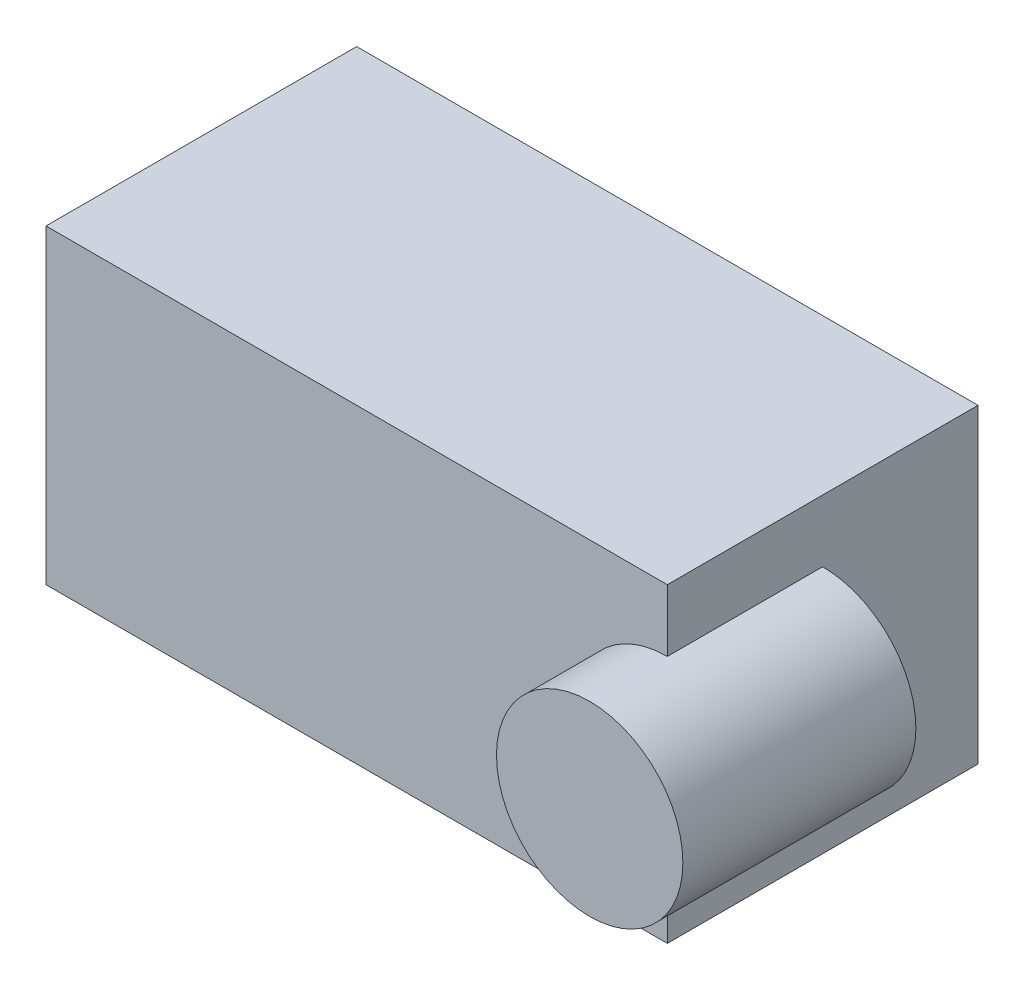
ISO-10303-21;
HEADER;
FILE_DESCRIPTION(('STEP AP214'),'2;1');
FILE_NAME('part.step','',(''),(''),'','','');
FILE_SCHEMA(('AUTOMOTIVE_DESIGN { 1 0 10303 214 1 1 1 1 }'));
ENDSEC;
DATA;
#1=APPLICATION_CONTEXT('core data for automotive mechanical design processes');
#2=APPLICATION_PROTOCOL_DEFINITION('international standard','automotive_design',2000,#1);
#3=PRODUCT_CONTEXT('',#1,'mechanical');
#4=PRODUCT('Part','Part','',(#3));
#5=PRODUCT_RELATED_PRODUCT_CATEGORY('part','',(#4));
#6=PRODUCT_DEFINITION_FORMATION('','',#4);
#7=PRODUCT_DEFINITION_CONTEXT('part definition',#1,'design');
#8=PRODUCT_DEFINITION('design','',#6,#7);
#9=PRODUCT_DEFINITION_SHAPE('','',#8);
#10=(LENGTH_UNIT() NAMED_UNIT(*) SI_UNIT(.MILLI.,.METRE.));
#11=(NAMED_UNIT(*) PLANE_ANGLE_UNIT() SI_UNIT($,.RADIAN.));
#12=(NAMED_UNIT(*) SI_UNIT($,.STERADIAN.) SOLID_ANGLE_UNIT());
#13=UNCERTAINTY_MEASURE_WITH_UNIT(LENGTH_MEASURE(1.E-05),#10,'distance_accuracy_value','');
#14=(GEOMETRIC_REPRESENTATION_CONTEXT(3) GLOBAL_UNCERTAINTY_ASSIGNED_CONTEXT((#13)) GLOBAL_UNIT_ASSIGNED_CONTEXT((#10,
#11,#12)) REPRESENTATION_CONTEXT('',''));
#15=CARTESIAN_POINT('',(0.,0.,0.));
#16=DIRECTION('',(0.,0.,1.));
#17=DIRECTION('',(1.,0.,0.));
#18=AXIS2_PLACEMENT_3D('',#15,#16,#17);
#19=CARTESIAN_POINT('',(40.,0.,10.));
#20=DIRECTION('',(-1.,0.,0.));
#21=DIRECTION('',(0.,0.,1.));
#22=AXIS2_PLACEMENT_3D('',#19,#20,#21);
#23=PLANE('',#22);
#24=DIRECTION('',(0.,0.,-1.));
#25=VECTOR('',#24,1.);
#26=CARTESIAN_POINT('',(40.,16.,15.));
#27=LINE('',#26,#25);
#28=CARTESIAN_POINT('',(40.,16.,0.));
#29=VERTEX_POINT('',#28);
#30=CARTESIAN_POINT('',(40.,16.,10.));
#31=VERTEX_POINT('',#30);
#32=EDGE_CURVE('E56',#29,#31,#27,.F.);
#33=ORIENTED_EDGE('',*,*,#32,.F.);
#34=DIRECTION('',(0.,1.,0.));
#35=VECTOR('',#34,1.);
#36=CARTESIAN_POINT('',(40.,0.,0.));
#37=LINE('',#36,#35);
#38=CARTESIAN_POINT('',(40.,4.,0.));
#39=VERTEX_POINT('',#38);
#40=EDGE_CURVE('E11',#39,#29,#37,.T.);
#41=ORIENTED_EDGE('',*,*,#40,.F.);
#42=DIRECTION('',(0.,0.,-1.));
#43=VECTOR('',#42,1.);
#44=CARTESIAN_POINT('',(40.,4.,15.));
#45=LINE('',#44,#43);
#46=CARTESIAN_POINT('',(40.,4.,10.));
#47=VERTEX_POINT('',#46);
#48=EDGE_CURVE('E109',#47,#39,#45,.T.);
#49=ORIENTED_EDGE('',*,*,#48,.F.);
#50=DIRECTION('',(0.,1.,0.));
#51=VECTOR('',#50,1.);
#52=CARTESIAN_POINT('',(40.,0.,10.));
#53=LINE('',#52,#51);
#54=CARTESIAN_POINT('',(40.,0.,10.));
#55=VERTEX_POINT('',#54);
#56=EDGE_CURVE('E125',#55,#47,#53,.T.);
#57=ORIENTED_EDGE('',*,*,#56,.F.);
#58=DIRECTION('',(0.,0.,-1.));
#59=VECTOR('',#58,1.);
#60=CARTESIAN_POINT('',(40.,0.,10.));
#61=LINE('',#60,#59);
#62=CARTESIAN_POINT('',(40.,0.,-10.));
#63=VERTEX_POINT('',#62);
#64=EDGE_CURVE('E137',#55,#63,#61,.T.);
#65=ORIENTED_EDGE('',*,*,#64,.T.);
#66=DIRECTION('',(0.,1.,0.));
#67=VECTOR('',#66,1.);
#68=CARTESIAN_POINT('',(40.,0.,-10.));
#69=LINE('',#68,#67);
#70=CARTESIAN_POINT('',(40.,20.,-10.));
#71=VERTEX_POINT('',#70);
#72=EDGE_CURVE('E131',#63,#71,#69,.T.);
#73=ORIENTED_EDGE('',*,*,#72,.T.);
#74=DIRECTION('',(0.,0.,-1.));
#75=VECTOR('',#74,1.);
#76=CARTESIAN_POINT('',(40.,20.,10.));
#77=LINE('',#76,#75);
#78=CARTESIAN_POINT('',(40.,20.,10.));
#79=VERTEX_POINT('',#78);
#80=EDGE_CURVE('E135',#79,#71,#77,.T.);
#81=ORIENTED_EDGE('',*,*,#80,.F.);
#82=EDGE_CURVE('E114',#31,#79,#53,.T.);
#83=ORIENTED_EDGE('',*,*,#82,.F.);
#84=EDGE_LOOP('',(#33,#41,#49,#57,#65,#73,#81,#83));
#85=FACE_BOUND('',#84,.T.);
#86=ADVANCED_FACE('F41',(#85),#23,.F.);
#87=CARTESIAN_POINT('',(0.,20.,10.));
#88=DIRECTION('',(1.,0.,0.));
#89=DIRECTION('',(0.,0.,-1.));
#90=AXIS2_PLACEMENT_3D('',#87,#88,#89);
#91=PLANE('',#90);
#92=DIRECTION('',(0.,-1.,0.));
#93=VECTOR('',#92,1.);
#94=CARTESIAN_POINT('',(0.,20.,-10.));
#95=LINE('',#94,#93);
#96=CARTESIAN_POINT('',(0.,20.,-10.));
#97=VERTEX_POINT('',#96);
#98=CARTESIAN_POINT('',(0.,0.,-10.));
#99=VERTEX_POINT('',#98);
#100=EDGE_CURVE('E115',#97,#99,#95,.T.);
#101=ORIENTED_EDGE('',*,*,#100,.T.);
#102=DIRECTION('',(0.,0.,-1.));
#103=VECTOR('',#102,1.);
#104=CARTESIAN_POINT('',(0.,0.,10.));
#105=LINE('',#104,#103);
#106=CARTESIAN_POINT('',(0.,0.,10.));
#107=VERTEX_POINT('',#106);
#108=EDGE_CURVE('E140',#107,#99,#105,.T.);
#109=ORIENTED_EDGE('',*,*,#108,.F.);
#110=DIRECTION('',(0.,-1.,0.));
#111=VECTOR('',#110,1.);
#112=CARTESIAN_POINT('',(0.,20.,10.));
#113=LINE('',#112,#111);
#114=CARTESIAN_POINT('',(0.,20.,10.));
#115=VERTEX_POINT('',#114);
#116=EDGE_CURVE('E122',#115,#107,#113,.T.);
#117=ORIENTED_EDGE('',*,*,#116,.F.);
#118=DIRECTION('',(0.,0.,-1.));
#119=VECTOR('',#118,1.);
#120=CARTESIAN_POINT('',(0.,20.,10.));
#121=LINE('',#120,#119);
#122=EDGE_CURVE('E128',#115,#97,#121,.T.);
#123=ORIENTED_EDGE('',*,*,#122,.T.);
#124=EDGE_LOOP('',(#101,#109,#117,#123));
#125=FACE_BOUND('',#124,.T.);
#126=ADVANCED_FACE('F43',(#125),#91,.F.);
#127=CARTESIAN_POINT('',(0.,0.,10.));
#128=DIRECTION('',(0.,1.,0.));
#129=DIRECTION('',(0.,0.,1.));
#130=AXIS2_PLACEMENT_3D('',#127,#128,#129);
#131=PLANE('',#130);
#132=DIRECTION('',(1.,0.,0.));
#133=VECTOR('',#132,1.);
#134=CARTESIAN_POINT('',(0.,0.,-10.));
#135=LINE('',#134,#133);
#136=EDGE_CURVE('E118',#99,#63,#135,.T.);
#137=ORIENTED_EDGE('',*,*,#136,.T.);
#138=ORIENTED_EDGE('',*,*,#64,.F.);
#139=DIRECTION('',(1.,0.,0.));
#140=VECTOR('',#139,1.);
#141=CARTESIAN_POINT('',(0.,0.,10.));
#142=LINE('',#141,#140);
#143=EDGE_CURVE('E94',#107,#55,#142,.T.);
#144=ORIENTED_EDGE('',*,*,#143,.F.);
#145=ORIENTED_EDGE('',*,*,#108,.T.);
#146=EDGE_LOOP('',(#137,#138,#144,#145));
#147=FACE_BOUND('',#146,.T.);
#148=ADVANCED_FACE('F152',(#147),#131,.F.);
#149=CARTESIAN_POINT('',(40.,20.,10.));
#150=DIRECTION('',(0.,-1.,0.));
#151=DIRECTION('',(0.,0.,-1.));
#152=AXIS2_PLACEMENT_3D('',#149,#150,#151);
#153=PLANE('',#152);
#154=DIRECTION('',(-1.,0.,0.));
#155=VECTOR('',#154,1.);
#156=CARTESIAN_POINT('',(40.,20.,-10.));
#157=LINE('',#156,#155);
#158=EDGE_CURVE('E86',#71,#97,#157,.T.);
#159=ORIENTED_EDGE('',*,*,#158,.T.);
#160=ORIENTED_EDGE('',*,*,#122,.F.);
#161=DIRECTION('',(-1.,0.,0.));
#162=VECTOR('',#161,1.);
#163=CARTESIAN_POINT('',(40.,20.,10.));
#164=LINE('',#163,#162);
#165=EDGE_CURVE('E65',#79,#115,#164,.T.);
#166=ORIENTED_EDGE('',*,*,#165,.F.);
#167=ORIENTED_EDGE('',*,*,#80,.T.);
#168=EDGE_LOOP('',(#159,#160,#166,#167));
#169=FACE_BOUND('',#168,.T.);
#170=ADVANCED_FACE('F150',(#169),#153,.F.);
#171=CARTESIAN_POINT('',(0.,0.,10.));
#172=DIRECTION('',(0.,0.,1.));
#173=DIRECTION('',(1.,0.,0.));
#174=AXIS2_PLACEMENT_3D('',#171,#172,#173);
#175=PLANE('',#174);
#176=ORIENTED_EDGE('',*,*,#56,.T.);
#177=CARTESIAN_POINT('',(40.,10.,10.));
#178=DIRECTION('',(0.,0.,1.));
#179=DIRECTION('',(1.,0.,0.));
#180=AXIS2_PLACEMENT_3D('',#177,#178,#179);
#181=CIRCLE('',#180,6.);
#182=EDGE_CURVE('E49',#47,#31,#181,.F.);
#183=ORIENTED_EDGE('',*,*,#182,.T.);
#184=ORIENTED_EDGE('',*,*,#82,.T.);
#185=ORIENTED_EDGE('',*,*,#165,.T.);
#186=ORIENTED_EDGE('',*,*,#116,.T.);
#187=ORIENTED_EDGE('',*,*,#143,.T.);
#188=EDGE_LOOP('',(#176,#183,#184,#185,#186,#187));
#189=FACE_BOUND('',#188,.T.);
#190=ADVANCED_FACE('F141',(#189),#175,.T.);
#191=CARTESIAN_POINT('',(0.,0.,-10.));
#192=DIRECTION('',(0.,0.,1.));
#193=DIRECTION('',(1.,0.,0.));
#194=AXIS2_PLACEMENT_3D('',#191,#192,#193);
#195=PLANE('',#194);
#196=ORIENTED_EDGE('',*,*,#100,.F.);
#197=ORIENTED_EDGE('',*,*,#158,.F.);
#198=ORIENTED_EDGE('',*,*,#72,.F.);
#199=ORIENTED_EDGE('',*,*,#136,.F.);
#200=EDGE_LOOP('',(#196,#197,#198,#199));
#201=FACE_BOUND('',#200,.T.);
#202=ADVANCED_FACE('F146',(#201),#195,.F.);
#203=CARTESIAN_POINT('',(40.,10.,0.));
#204=DIRECTION('',(0.,0.,1.));
#205=DIRECTION('',(1.,0.,0.));
#206=AXIS2_PLACEMENT_3D('',#203,#204,#205);
#207=PLANE('',#206);
#208=CARTESIAN_POINT('',(40.,10.,0.));
#209=DIRECTION('',(0.,0.,1.));
#210=DIRECTION('',(1.,0.,0.));
#211=AXIS2_PLACEMENT_3D('',#208,#209,#210);
#212=CIRCLE('',#211,6.);
#213=EDGE_CURVE('E105',#39,#29,#212,.T.);
#214=ORIENTED_EDGE('',*,*,#213,.F.);
#215=ORIENTED_EDGE('',*,*,#40,.T.);
#216=EDGE_LOOP('',(#214,#215));
#217=FACE_BOUND('',#216,.T.);
#218=ADVANCED_FACE('F104',(#217),#207,.F.);
#219=CARTESIAN_POINT('',(40.,10.,15.));
#220=DIRECTION('',(0.,0.,-1.));
#221=DIRECTION('',(-1.,0.,0.));
#222=AXIS2_PLACEMENT_3D('',#219,#220,#221);
#223=CYLINDRICAL_SURFACE('',#222,6.);
#224=CARTESIAN_POINT('',(40.,10.,15.));
#225=DIRECTION('',(0.,0.,1.));
#226=DIRECTION('',(1.,0.,0.));
#227=AXIS2_PLACEMENT_3D('',#224,#225,#226);
#228=CIRCLE('',#227,6.);
#229=CARTESIAN_POINT('',(46.,10.,15.));
#230=VERTEX_POINT('',#229);
#231=EDGE_CURVE('E110',#230,#230,#228,.T.);
#232=ORIENTED_EDGE('',*,*,#231,.F.);
#233=EDGE_LOOP('',(#232));
#234=FACE_BOUND('',#233,.T.);
#235=ORIENTED_EDGE('',*,*,#213,.T.);
#236=ORIENTED_EDGE('',*,*,#32,.T.);
#237=ORIENTED_EDGE('',*,*,#182,.F.);
#238=ORIENTED_EDGE('',*,*,#48,.T.);
#239=EDGE_LOOP('',(#235,#236,#237,#238));
#240=FACE_BOUND('',#239,.T.);
#241=ADVANCED_FACE('F108',(#234,#240),#223,.T.);
#242=CARTESIAN_POINT('',(40.,10.,15.));
#243=DIRECTION('',(0.,0.,1.));
#244=DIRECTION('',(1.,0.,0.));
#245=AXIS2_PLACEMENT_3D('',#242,#243,#244);
#246=PLANE('',#245);
#247=ORIENTED_EDGE('',*,*,#231,.T.);
#248=EDGE_LOOP('',(#247));
#249=FACE_BOUND('',#248,.T.);
#250=ADVANCED_FACE('F211',(#249),#246,.T.);
#251=CLOSED_SHELL('',(#86,#126,#148,#170,#190,#202,#218,#241,#250));
#252=MANIFOLD_SOLID_BREP('B2',#251);
#253=ADVANCED_BREP_SHAPE_REPRESENTATION('',(#18,#252),#14);
#254=SHAPE_DEFINITION_REPRESENTATION(#9,#253);
ENDSEC;
END-ISO-10303-21;
